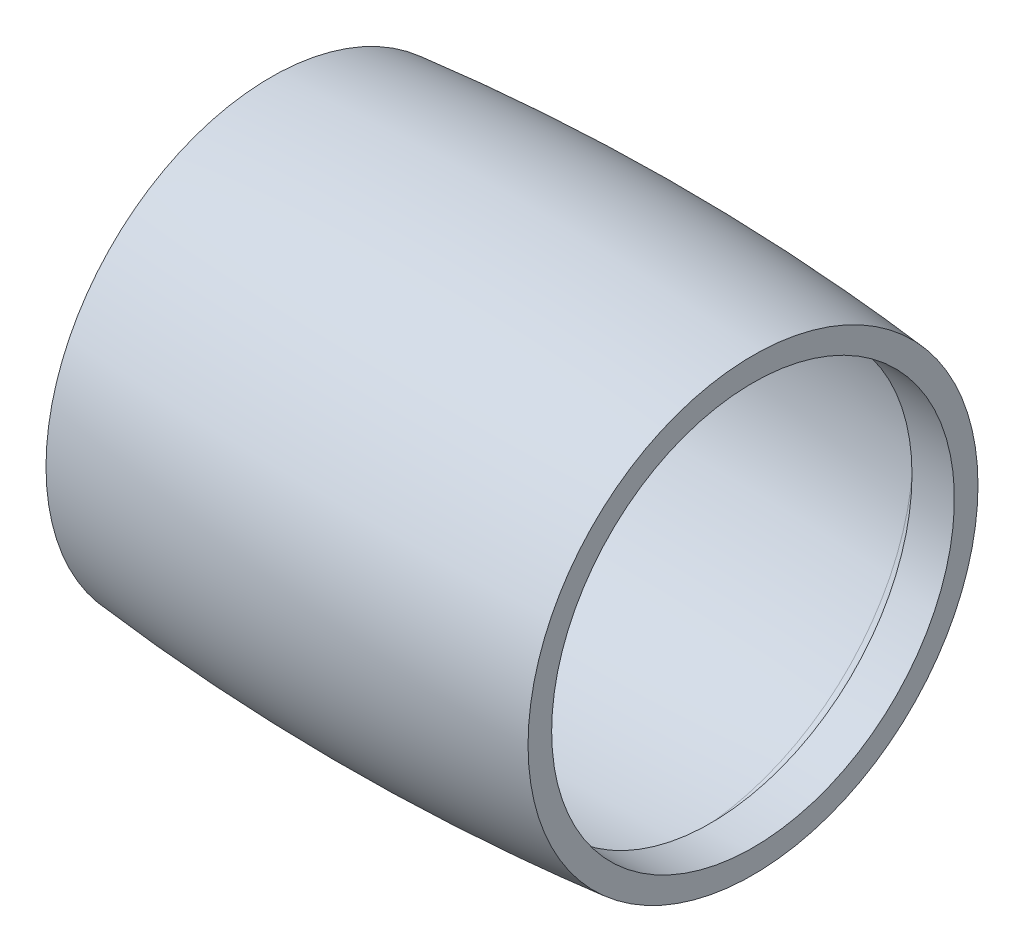
ISO-10303-21;
HEADER;
FILE_DESCRIPTION(('STEP AP214'),'2;1');
FILE_NAME('part.step','',(''),(''),'','','');
FILE_SCHEMA(('AUTOMOTIVE_DESIGN { 1 0 10303 214 1 1 1 1 }'));
ENDSEC;
DATA;
#1=APPLICATION_CONTEXT('core data for automotive mechanical design processes');
#2=APPLICATION_PROTOCOL_DEFINITION('international standard','automotive_design',2000,#1);
#3=PRODUCT_CONTEXT('',#1,'mechanical');
#4=PRODUCT('Part','Part','',(#3));
#5=PRODUCT_RELATED_PRODUCT_CATEGORY('part','',(#4));
#6=PRODUCT_DEFINITION_FORMATION('','',#4);
#7=PRODUCT_DEFINITION_CONTEXT('part definition',#1,'design');
#8=PRODUCT_DEFINITION('design','',#6,#7);
#9=PRODUCT_DEFINITION_SHAPE('','',#8);
#10=(LENGTH_UNIT() NAMED_UNIT(*) SI_UNIT(.MILLI.,.METRE.));
#11=(NAMED_UNIT(*) PLANE_ANGLE_UNIT() SI_UNIT($,.RADIAN.));
#12=(NAMED_UNIT(*) SI_UNIT($,.STERADIAN.) SOLID_ANGLE_UNIT());
#13=UNCERTAINTY_MEASURE_WITH_UNIT(LENGTH_MEASURE(1.E-05),#10,'distance_accuracy_value','');
#14=(GEOMETRIC_REPRESENTATION_CONTEXT(3) GLOBAL_UNCERTAINTY_ASSIGNED_CONTEXT((#13)) GLOBAL_UNIT_ASSIGNED_CONTEXT((#10,
#11,#12)) REPRESENTATION_CONTEXT('',''));
#15=CARTESIAN_POINT('',(0.,0.,0.));
#16=DIRECTION('',(0.,0.,1.));
#17=DIRECTION('',(1.,0.,0.));
#18=AXIS2_PLACEMENT_3D('',#15,#16,#17);
#19=CARTESIAN_POINT('',(0.,0.,0.));
#20=DIRECTION('',(-1.,0.,0.));
#21=DIRECTION('',(0.,0.,1.));
#22=AXIS2_PLACEMENT_3D('',#19,#20,#21);
#23=DEGENERATE_TOROIDAL_SURFACE('',#22,377.36605625,416.46605625,.F.);
#24=CARTESIAN_POINT('',(29.9279981719336,0.,0.));
#25=DIRECTION('',(-1.,0.,0.));
#26=DIRECTION('',(0.,0.,1.));
#27=AXIS2_PLACEMENT_3D('',#24,#25,#26);
#28=CIRCLE('',#27,38.0232682804325);
#29=CARTESIAN_POINT('',(29.9279981719336,0.,38.0232682804325));
#30=VERTEX_POINT('',#29);
#31=EDGE_CURVE('E10',#30,#30,#28,.F.);
#32=ORIENTED_EDGE('',*,*,#31,.T.);
#33=EDGE_LOOP('',(#32));
#34=FACE_BOUND('',#33,.T.);
#35=CARTESIAN_POINT('',(-29.9279981721732,0.,0.));
#36=DIRECTION('',(1.,0.,0.));
#37=DIRECTION('',(0.,0.,-1.));
#38=AXIS2_PLACEMENT_3D('',#35,#36,#37);
#39=CIRCLE('',#38,38.0232682804153);
#40=CARTESIAN_POINT('',(-29.9279981721732,0.,-38.0232682804153));
#41=VERTEX_POINT('',#40);
#42=EDGE_CURVE('E38',#41,#41,#39,.F.);
#43=ORIENTED_EDGE('',*,*,#42,.T.);
#44=EDGE_LOOP('',(#43));
#45=FACE_BOUND('',#44,.T.);
#46=ADVANCED_FACE('F31',(#34,#45),#23,.T.);
#47=CARTESIAN_POINT('',(40.815,0.,0.));
#48=DIRECTION('',(-1.,0.,0.));
#49=DIRECTION('',(0.,0.,1.));
#50=AXIS2_PLACEMENT_3D('',#47,#48,#49);
#51=CYLINDRICAL_SURFACE('',#50,34.1);
#52=CARTESIAN_POINT('',(-33.64,0.,0.));
#53=DIRECTION('',(-1.,0.,0.));
#54=DIRECTION('',(0.,0.,1.));
#55=AXIS2_PLACEMENT_3D('',#52,#53,#54);
#56=CIRCLE('',#55,34.1);
#57=CARTESIAN_POINT('',(-33.64,0.,34.1));
#58=VERTEX_POINT('',#57);
#59=EDGE_CURVE('E49',#58,#58,#56,.T.);
#60=ORIENTED_EDGE('',*,*,#59,.F.);
#61=EDGE_LOOP('',(#60));
#62=FACE_BOUND('',#61,.T.);
#63=CARTESIAN_POINT('',(-40.815,0.,0.));
#64=DIRECTION('',(1.,0.,0.));
#65=DIRECTION('',(0.,0.,-1.));
#66=AXIS2_PLACEMENT_3D('',#63,#64,#65);
#67=CIRCLE('',#66,34.1);
#68=CARTESIAN_POINT('',(-40.815,0.,-34.1));
#69=VERTEX_POINT('',#68);
#70=EDGE_CURVE('E56',#69,#69,#67,.T.);
#71=ORIENTED_EDGE('',*,*,#70,.F.);
#72=EDGE_LOOP('',(#71));
#73=FACE_BOUND('',#72,.T.);
#74=ADVANCED_FACE('F71',(#62,#73),#51,.F.);
#75=CARTESIAN_POINT('',(40.815,0.,0.));
#76=DIRECTION('',(-1.,0.,0.));
#77=DIRECTION('',(0.,0.,1.));
#78=AXIS2_PLACEMENT_3D('',#75,#76,#77);
#79=CIRCLE('',#78,34.1);
#80=CARTESIAN_POINT('',(40.815,0.,34.1));
#81=VERTEX_POINT('',#80);
#82=EDGE_CURVE('E52',#81,#81,#79,.T.);
#83=ORIENTED_EDGE('',*,*,#82,.F.);
#84=EDGE_LOOP('',(#83));
#85=FACE_BOUND('',#84,.T.);
#86=CARTESIAN_POINT('',(33.64,0.,0.));
#87=DIRECTION('',(1.,0.,0.));
#88=DIRECTION('',(0.,0.,-1.));
#89=AXIS2_PLACEMENT_3D('',#86,#87,#88);
#90=CIRCLE('',#89,34.1);
#91=CARTESIAN_POINT('',(33.64,0.,-34.1));
#92=VERTEX_POINT('',#91);
#93=EDGE_CURVE('E51',#92,#92,#90,.T.);
#94=ORIENTED_EDGE('',*,*,#93,.F.);
#95=EDGE_LOOP('',(#94));
#96=FACE_BOUND('',#95,.T.);
#97=ADVANCED_FACE('F67',(#85,#96),#51,.F.);
#98=CARTESIAN_POINT('',(-40.815,0.,0.));
#99=DIRECTION('',(1.,0.,0.));
#100=DIRECTION('',(0.,0.,-1.));
#101=AXIS2_PLACEMENT_3D('',#98,#99,#100);
#102=PLANE('',#101);
#103=ORIENTED_EDGE('',*,*,#70,.T.);
#104=EDGE_LOOP('',(#103));
#105=FACE_BOUND('',#104,.T.);
#106=CARTESIAN_POINT('',(-40.815,0.,0.));
#107=DIRECTION('',(-1.,0.,0.));
#108=DIRECTION('',(0.,0.,1.));
#109=AXIS2_PLACEMENT_3D('',#106,#107,#108);
#110=CIRCLE('',#109,38.1);
#111=CARTESIAN_POINT('',(-40.815,0.,38.1));
#112=VERTEX_POINT('',#111);
#113=EDGE_CURVE('E42',#112,#112,#110,.T.);
#114=ORIENTED_EDGE('',*,*,#113,.T.);
#115=EDGE_LOOP('',(#114));
#116=FACE_BOUND('',#115,.T.);
#117=ADVANCED_FACE('F70',(#105,#116),#102,.F.);
#118=CARTESIAN_POINT('',(0.,0.,0.));
#119=DIRECTION('',(-1.,0.,0.));
#120=DIRECTION('',(0.,0.,1.));
#121=AXIS2_PLACEMENT_3D('',#118,#119,#120);
#122=DEGENERATE_TOROIDAL_SURFACE('',#121,377.36605625,417.46605625,.F.);
#123=ORIENTED_EDGE('',*,*,#113,.F.);
#124=EDGE_LOOP('',(#123));
#125=FACE_BOUND('',#124,.T.);
#126=CARTESIAN_POINT('',(40.815,0.,0.));
#127=DIRECTION('',(-1.,0.,0.));
#128=DIRECTION('',(0.,0.,1.));
#129=AXIS2_PLACEMENT_3D('',#126,#127,#128);
#130=CIRCLE('',#129,38.1);
#131=CARTESIAN_POINT('',(40.815,0.,38.1));
#132=VERTEX_POINT('',#131);
#133=EDGE_CURVE('E46',#132,#132,#130,.T.);
#134=ORIENTED_EDGE('',*,*,#133,.T.);
#135=EDGE_LOOP('',(#134));
#136=FACE_BOUND('',#135,.T.);
#137=ADVANCED_FACE('F83',(#125,#136),#122,.F.);
#138=CARTESIAN_POINT('',(40.815,0.,0.));
#139=DIRECTION('',(-1.,0.,0.));
#140=DIRECTION('',(0.,0.,1.));
#141=AXIS2_PLACEMENT_3D('',#138,#139,#140);
#142=PLANE('',#141);
#143=ORIENTED_EDGE('',*,*,#82,.T.);
#144=EDGE_LOOP('',(#143));
#145=FACE_BOUND('',#144,.T.);
#146=ORIENTED_EDGE('',*,*,#133,.F.);
#147=EDGE_LOOP('',(#146));
#148=FACE_BOUND('',#147,.T.);
#149=ADVANCED_FACE('F64',(#145,#148),#142,.F.);
#150=CARTESIAN_POINT('',(29.6405509937275,0.,0.));
#151=DIRECTION('',(-1.,0.,0.));
#152=DIRECTION('',(0.,0.,1.));
#153=AXIS2_PLACEMENT_3D('',#150,#151,#152);
#154=TOROIDAL_SURFACE('',#153,34.0336098840621,4.);
#155=ORIENTED_EDGE('',*,*,#31,.F.);
#156=EDGE_LOOP('',(#155));
#157=FACE_BOUND('',#156,.T.);
#158=ORIENTED_EDGE('',*,*,#93,.T.);
#159=EDGE_LOOP('',(#158));
#160=FACE_BOUND('',#159,.T.);
#161=ADVANCED_FACE('F75',(#157,#160),#154,.F.);
#162=CARTESIAN_POINT('',(-29.6405509939647,0.,0.));
#163=DIRECTION('',(-1.,0.,0.));
#164=DIRECTION('',(0.,0.,1.));
#165=AXIS2_PLACEMENT_3D('',#162,#163,#164);
#166=TOROIDAL_SURFACE('',#165,34.0336098840428,4.);
#167=ORIENTED_EDGE('',*,*,#59,.T.);
#168=EDGE_LOOP('',(#167));
#169=FACE_BOUND('',#168,.T.);
#170=ORIENTED_EDGE('',*,*,#42,.F.);
#171=EDGE_LOOP('',(#170));
#172=FACE_BOUND('',#171,.T.);
#173=ADVANCED_FACE('F33',(#169,#172),#166,.F.);
#174=CLOSED_SHELL('',(#46,#74,#97,#117,#137,#149,#161,#173));
#175=MANIFOLD_SOLID_BREP('B2',#174);
#176=ADVANCED_BREP_SHAPE_REPRESENTATION('',(#18,#175),#14);
#177=SHAPE_DEFINITION_REPRESENTATION(#9,#176);
ENDSEC;
END-ISO-10303-21;
